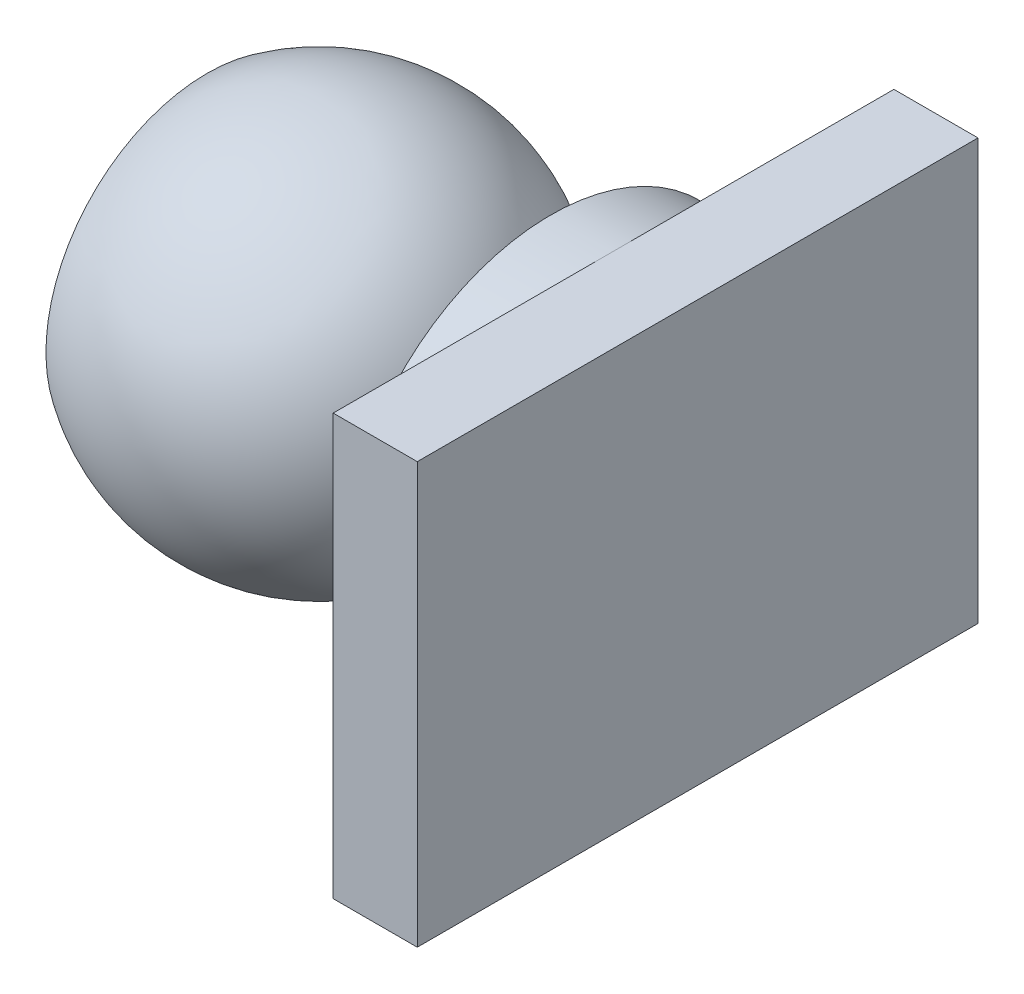
ISO-10303-21;
HEADER;
FILE_DESCRIPTION(('STEP AP214'),'2;1');
FILE_NAME('part.step','',(''),(''),'','','');
FILE_SCHEMA(('AUTOMOTIVE_DESIGN { 1 0 10303 214 1 1 1 1 }'));
ENDSEC;
DATA;
#1=APPLICATION_CONTEXT('core data for automotive mechanical design processes');
#2=APPLICATION_PROTOCOL_DEFINITION('international standard','automotive_design',2000,#1);
#3=PRODUCT_CONTEXT('',#1,'mechanical');
#4=PRODUCT('Part','Part','',(#3));
#5=PRODUCT_RELATED_PRODUCT_CATEGORY('part','',(#4));
#6=PRODUCT_DEFINITION_FORMATION('','',#4);
#7=PRODUCT_DEFINITION_CONTEXT('part definition',#1,'design');
#8=PRODUCT_DEFINITION('design','',#6,#7);
#9=PRODUCT_DEFINITION_SHAPE('','',#8);
#10=(LENGTH_UNIT() NAMED_UNIT(*) SI_UNIT(.MILLI.,.METRE.));
#11=(NAMED_UNIT(*) PLANE_ANGLE_UNIT() SI_UNIT($,.RADIAN.));
#12=(NAMED_UNIT(*) SI_UNIT($,.STERADIAN.) SOLID_ANGLE_UNIT());
#13=UNCERTAINTY_MEASURE_WITH_UNIT(LENGTH_MEASURE(1.E-05),#10,'distance_accuracy_value','');
#14=(GEOMETRIC_REPRESENTATION_CONTEXT(3) GLOBAL_UNCERTAINTY_ASSIGNED_CONTEXT((#13)) GLOBAL_UNIT_ASSIGNED_CONTEXT((#10,
#11,#12)) REPRESENTATION_CONTEXT('',''));
#15=CARTESIAN_POINT('',(0.,0.,0.));
#16=DIRECTION('',(0.,0.,1.));
#17=DIRECTION('',(1.,0.,0.));
#18=AXIS2_PLACEMENT_3D('',#15,#16,#17);
#19=CARTESIAN_POINT('',(-1.14466287279129,0.,0.));
#20=DIRECTION('',(1.,0.,0.));
#21=DIRECTION('',(0.,1.,0.));
#22=AXIS2_PLACEMENT_3D('',#19,#20,#21);
#23=SPHERICAL_SURFACE('',#22,7.);
#24=CARTESIAN_POINT('',(5.53260744297285,0.,0.));
#25=DIRECTION('',(1.,0.,0.));
#26=DIRECTION('',(0.,1.,0.));
#27=AXIS2_PLACEMENT_3D('',#24,#25,#26);
#28=CIRCLE('',#27,2.10096671325728);
#29=CARTESIAN_POINT('',(5.53260744297285,2.10096671325727,0.));
#30=VERTEX_POINT('',#29);
#31=EDGE_CURVE('E11',#30,#30,#28,.T.);
#32=CARTESIAN_POINT('',(-5.14466287279128,0.,0.));
#33=DIRECTION('',(1.,0.,0.));
#34=DIRECTION('',(0.,1.,0.));
#35=AXIS2_PLACEMENT_3D('',#32,#33,#34);
#36=CIRCLE('',#35,5.74456264653803);
#37=CARTESIAN_POINT('',(-5.14466287279128,5.74456264653803,0.));
#38=VERTEX_POINT('',#37);
#39=EDGE_CURVE('E46',#38,#38,#36,.T.);
#40=CARTESIAN_POINT('',(5.53260744297285,2.10096671325727,0.));
#41=CARTESIAN_POINT('',(5.49159495765166,2.23132856058572,0.));
#42=CARTESIAN_POINT('',(5.44675587625044,2.3604858663158,0.));
#43=CARTESIAN_POINT('',(5.34959851795419,2.61595616380762,0.));
#44=CARTESIAN_POINT('',(5.29728024105916,2.74226915556936,0.));
#45=CARTESIAN_POINT('',(5.18533848844152,2.99161559435286,0.));
#46=CARTESIAN_POINT('',(5.12571501271891,3.11464904137463,0.));
#47=CARTESIAN_POINT('',(4.99936878362031,3.35701502016635,0.));
#48=CARTESIAN_POINT('',(4.93264603024432,3.47634755193632,0.));
#49=CARTESIAN_POINT('',(4.79232967131904,3.71090232107542,0.));
#50=CARTESIAN_POINT('',(4.71873606576977,3.82612455844456,0.));
#51=CARTESIAN_POINT('',(4.56493048385377,4.05206364285529,0.));
#52=CARTESIAN_POINT('',(4.48471850748704,4.16278048989689,0.));
#53=CARTESIAN_POINT('',(4.31795122968552,4.3793290979356,0.));
#54=CARTESIAN_POINT('',(4.23139592825073,4.48516085893272,0.));
#55=CARTESIAN_POINT('',(4.0522388348717,4.69157636523167,0.));
#56=CARTESIAN_POINT('',(3.95963704292746,4.7921601105335,0.));
#57=CARTESIAN_POINT('',(3.76870452903353,4.98773464938184,0.));
#58=CARTESIAN_POINT('',(3.67037380708383,5.08272544292834,0.));
#59=CARTESIAN_POINT('',(3.4683206426432,5.26678832327508,0.));
#60=CARTESIAN_POINT('',(3.36459820015225,5.35586041007532,0.));
#61=CARTESIAN_POINT('',(3.15211729342448,5.527780418904,0.));
#62=CARTESIAN_POINT('',(3.04335882918765,5.61062834093245,0.));
#63=CARTESIAN_POINT('',(2.82117884814866,5.76981590700381,0.));
#64=CARTESIAN_POINT('',(2.70775733134651,5.84615555104672,0.));
#65=CARTESIAN_POINT('',(2.47664020547504,5.99206476697619,0.));
#66=CARTESIAN_POINT('',(2.35894459640573,6.06163433886275,0.));
#67=CARTESIAN_POINT('',(2.11968290360283,6.19376483315496,0.));
#68=CARTESIAN_POINT('',(1.99811681986925,6.25632575556062,0.));
#69=CARTESIAN_POINT('',(1.75153106848908,6.37422440856788,0.));
#70=CARTESIAN_POINT('',(1.6265114008425,6.42956213916948,0.));
#71=CARTESIAN_POINT('',(1.37344721588261,6.53282463698589,0.));
#72=CARTESIAN_POINT('',(1.24540269856931,6.5807494042007,0.));
#73=CARTESIAN_POINT('',(0.986727921743054,6.66902162519102,0.));
#74=CARTESIAN_POINT('',(0.856097662230093,6.70936907896652,0.));
#75=CARTESIAN_POINT('',(0.592699375846243,6.78234830816734,0.));
#76=CARTESIAN_POINT('',(0.459931348975354,6.81498008359267,0.));
#77=CARTESIAN_POINT('',(0.192712833836634,6.87241605082318,0.));
#78=CARTESIAN_POINT('',(0.0582623455688026,6.89722024262837,0.));
#79=CARTESIAN_POINT('',(-0.211860016680608,6.93891598075124,0.));
#80=CARTESIAN_POINT('',(-0.347531890662186,6.95580752706891,0.));
#81=CARTESIAN_POINT('',(-0.619631760113896,6.98162004745347,0.));
#82=CARTESIAN_POINT('',(-0.756059755584026,6.99054102152036,0.));
#83=CARTESIAN_POINT('',(-1.02920401080155,7.0003818044096,0.));
#84=CARTESIAN_POINT('',(-1.16592027054894,7.00130161323194,0.));
#85=CARTESIAN_POINT('',(-1.43917220852773,6.99513691126486,0.));
#86=CARTESIAN_POINT('',(-1.57570788675914,6.98805240047543,0.));
#87=CARTESIAN_POINT('',(-1.8481304352892,6.9659033545727,0.));
#88=CARTESIAN_POINT('',(-1.98401730558785,6.95083881945939,0.));
#89=CARTESIAN_POINT('',(-2.25467623643408,6.91278138574693,0.));
#90=CARTESIAN_POINT('',(-2.38944829698164,6.88978848714778,0.));
#91=CARTESIAN_POINT('',(-2.65741543098438,6.83595317863161,0.));
#92=CARTESIAN_POINT('',(-2.79061050443956,6.8051107687146,0.));
#93=CARTESIAN_POINT('',(-3.0549668896268,6.73568219967009,0.));
#94=CARTESIAN_POINT('',(-3.18612820135887,6.69709604054261,0.));
#95=CARTESIAN_POINT('',(-3.4459672827185,6.61231232340858,0.));
#96=CARTESIAN_POINT('',(-3.57464505234607,6.56611476540204,0.));
#97=CARTESIAN_POINT('',(-3.82907571211598,6.46626658225889,0.));
#98=CARTESIAN_POINT('',(-3.95482860225833,6.41261595712228,0.));
#99=CARTESIAN_POINT('',(-4.20297847184933,6.2980459806665,0.));
#100=CARTESIAN_POINT('',(-4.32537545129798,6.23712662934733,0.));
#101=CARTESIAN_POINT('',(-4.56639294759904,6.10822678842464,0.));
#102=CARTESIAN_POINT('',(-4.68501346445143,6.0402462988211,0.));
#103=CARTESIAN_POINT('',(-4.91807427556426,5.89746225386126,0.));
#104=CARTESIAN_POINT('',(-5.03251456982469,5.82265869850494,0.));
#105=CARTESIAN_POINT('',(-5.14466287279128,5.74456264653803,0.));
#106=B_SPLINE_CURVE_WITH_KNOTS('',3,(#40,#41,#42,#43,#44,#45,#46,#47,#48,#49,#50,#51,#52,#53,
#54,#55,#56,#57,#58,#59,#60,#61,#62,#63,#64,#65,#66,#67,#68,#69,#70,#71,#72,#73,#74,#75,#76,#77,
#78,#79,#80,#81,#82,#83,#84,#85,#86,#87,#88,#89,#90,#91,#92,#93,#94,#95,#96,#97,#98,#99,#100,
#101,#102,#103,#104,#105),.UNSPECIFIED.,.F.,.F.,(4,2,2,2,2,2,2,2,2,2,2,2,2,2,2,2,2,2,2,2,2,2,2,
2,2,2,2,2,2,2,2,2,4),(0.,0.409923633462205,0.819847266924409,1.22977090038661,1.63969453384882,
2.04961816731102,2.45954180077323,2.86946543423543,3.27938906769764,3.68931270115984,
4.09923633462204,4.50915996808425,4.91908360154645,5.32900723500866,5.73893086847086,
6.14885450193307,6.55877813539527,6.96870176885747,7.37862540231968,7.78854903578188,
8.19847266924409,8.60839630270629,9.0183199361685,9.4282435696307,9.8381672030929,
10.2480908365551,10.6580144700173,11.0679381034795,11.4778617369417,11.8877853704039,
12.2977090038661,12.7076326373283,13.1175562707905),.UNSPECIFIED.);
#107=EDGE_CURVE('BSEAM39',#30,#38,#106,.T.);
#108=ORIENTED_EDGE('',*,*,#31,.F.);
#109=ORIENTED_EDGE('',*,*,#39,.T.);
#110=ORIENTED_EDGE('',*,*,#107,.T.);
#111=ORIENTED_EDGE('',*,*,#107,.F.);
#112=EDGE_LOOP('',(#108,#110,#109,#111));
#113=FACE_BOUND('',#112,.T.);
#114=ADVANCED_FACE('F39',(#113),#23,.T.);
#115=CARTESIAN_POINT('',(-5.14466287279128,5.74456264653803,0.));
#116=DIRECTION('',(-1.,0.,0.));
#117=DIRECTION('',(0.,-1.,0.));
#118=AXIS2_PLACEMENT_3D('',#115,#116,#117);
#119=PLANE('',#118);
#120=CARTESIAN_POINT('',(-5.14466287279128,0.,0.));
#121=DIRECTION('',(-1.,0.,0.));
#122=DIRECTION('',(0.,-1.,0.));
#123=AXIS2_PLACEMENT_3D('',#120,#121,#122);
#124=CIRCLE('',#123,5.1234753829798);
#125=CARTESIAN_POINT('',(-5.14466287279128,-5.1234753829798,0.));
#126=VERTEX_POINT('',#125);
#127=EDGE_CURVE('E120',#126,#126,#124,.F.);
#128=ORIENTED_EDGE('',*,*,#127,.T.);
#129=EDGE_LOOP('',(#128));
#130=FACE_BOUND('',#129,.T.);
#131=ORIENTED_EDGE('',*,*,#39,.F.);
#132=EDGE_LOOP('',(#131));
#133=FACE_BOUND('',#132,.T.);
#134=ADVANCED_FACE('F126',(#130,#133),#119,.T.);
#135=CARTESIAN_POINT('',(-1.14466287279129,0.,0.));
#136=DIRECTION('',(1.,0.,0.));
#137=DIRECTION('',(0.,1.,0.));
#138=AXIS2_PLACEMENT_3D('',#135,#136,#137);
#139=SPHERICAL_SURFACE('',#138,6.5);
#140=ORIENTED_EDGE('',*,*,#127,.F.);
#141=EDGE_LOOP('',(#140));
#142=FACE_BOUND('',#141,.T.);
#143=ADVANCED_FACE('F128',(#142),#139,.F.);
#144=CARTESIAN_POINT('',(-2.88466287279129,0.,0.));
#145=DIRECTION('',(-1.,0.,0.));
#146=DIRECTION('',(0.,0.,1.));
#147=AXIS2_PLACEMENT_3D('',#144,#145,#146);
#148=DEGENERATE_TOROIDAL_SURFACE('',#147,7.5,10.,.T.);
#149=CARTESIAN_POINT('',(7.11533712720871,0.,0.));
#150=DIRECTION('',(-1.,0.,0.));
#151=DIRECTION('',(0.,0.,1.));
#152=AXIS2_PLACEMENT_3D('',#149,#150,#151);
#153=CIRCLE('',#152,7.5);
#154=CARTESIAN_POINT('',(7.11533712720871,0.,7.5));
#155=VERTEX_POINT('',#154);
#156=EDGE_CURVE('E117',#155,#155,#153,.T.);
#157=ORIENTED_EDGE('',*,*,#156,.T.);
#158=EDGE_LOOP('',(#157));
#159=FACE_BOUND('',#158,.T.);
#160=ORIENTED_EDGE('',*,*,#31,.T.);
#161=EDGE_LOOP('',(#160));
#162=FACE_BOUND('',#161,.T.);
#163=ADVANCED_FACE('F133',(#159,#162),#148,.F.);
#164=CARTESIAN_POINT('',(0.,0.,0.));
#165=DIRECTION('',(-1.,0.,0.));
#166=DIRECTION('',(0.,0.,1.));
#167=AXIS2_PLACEMENT_3D('',#164,#165,#166);
#168=CYLINDRICAL_SURFACE('',#167,7.5);
#169=CARTESIAN_POINT('',(9.35533712720872,0.,0.));
#170=DIRECTION('',(-1.,0.,0.));
#171=DIRECTION('',(0.,0.,1.));
#172=AXIS2_PLACEMENT_3D('',#169,#170,#171);
#173=CIRCLE('',#172,7.5);
#174=CARTESIAN_POINT('',(9.35533712720872,7.5,0.));
#175=VERTEX_POINT('',#174);
#176=CARTESIAN_POINT('',(9.35533712720871,-7.5,0.));
#177=VERTEX_POINT('',#176);
#178=EDGE_CURVE('E110',#175,#177,#173,.T.);
#179=ORIENTED_EDGE('',*,*,#178,.T.);
#180=EDGE_CURVE('E60',#177,#175,#173,.T.);
#181=ORIENTED_EDGE('',*,*,#180,.T.);
#182=EDGE_LOOP('',(#179,#181));
#183=FACE_BOUND('',#182,.T.);
#184=ORIENTED_EDGE('',*,*,#156,.F.);
#185=EDGE_LOOP('',(#184));
#186=FACE_BOUND('',#185,.T.);
#187=ADVANCED_FACE('F141',(#183,#186),#168,.T.);
#188=CARTESIAN_POINT('',(9.35533712720871,0.,0.));
#189=DIRECTION('',(1.,0.,0.));
#190=DIRECTION('',(0.,0.,-1.));
#191=AXIS2_PLACEMENT_3D('',#188,#189,#190);
#192=PLANE('',#191);
#193=ORIENTED_EDGE('',*,*,#178,.F.);
#194=DIRECTION('',(0.,0.,1.));
#195=VECTOR('',#194,1.);
#196=CARTESIAN_POINT('',(9.35533712720871,7.5,10.));
#197=LINE('',#196,#195);
#198=CARTESIAN_POINT('',(9.35533712720871,7.5,-10.));
#199=VERTEX_POINT('',#198);
#200=EDGE_CURVE('E53',#199,#175,#197,.T.);
#201=ORIENTED_EDGE('',*,*,#200,.F.);
#202=DIRECTION('',(0.,1.,0.));
#203=VECTOR('',#202,1.);
#204=CARTESIAN_POINT('',(9.35533712720871,7.5,-10.));
#205=LINE('',#204,#203);
#206=CARTESIAN_POINT('',(9.35533712720871,-7.5,-10.));
#207=VERTEX_POINT('',#206);
#208=EDGE_CURVE('E108',#207,#199,#205,.T.);
#209=ORIENTED_EDGE('',*,*,#208,.F.);
#210=DIRECTION('',(0.,0.,-1.));
#211=VECTOR('',#210,1.);
#212=CARTESIAN_POINT('',(9.35533712720871,-7.5,10.));
#213=LINE('',#212,#211);
#214=EDGE_CURVE('E236',#177,#207,#213,.T.);
#215=ORIENTED_EDGE('',*,*,#214,.F.);
#216=EDGE_LOOP('',(#193,#201,#209,#215));
#217=FACE_BOUND('',#216,.T.);
#218=ADVANCED_FACE('F145',(#217),#192,.F.);
#219=CARTESIAN_POINT('',(12.3553371272087,7.5,-10.));
#220=DIRECTION('',(0.,0.,1.));
#221=DIRECTION('',(0.,-1.,0.));
#222=AXIS2_PLACEMENT_3D('',#219,#220,#221);
#223=PLANE('',#222);
#224=ORIENTED_EDGE('',*,*,#208,.T.);
#225=DIRECTION('',(-1.,0.,0.));
#226=VECTOR('',#225,1.);
#227=CARTESIAN_POINT('',(12.3553371272087,7.5,-10.));
#228=LINE('',#227,#226);
#229=CARTESIAN_POINT('',(12.3553371272087,7.5,-10.));
#230=VERTEX_POINT('',#229);
#231=EDGE_CURVE('E88',#230,#199,#228,.T.);
#232=ORIENTED_EDGE('',*,*,#231,.F.);
#233=DIRECTION('',(0.,1.,0.));
#234=VECTOR('',#233,1.);
#235=CARTESIAN_POINT('',(12.3553371272087,7.5,-10.));
#236=LINE('',#235,#234);
#237=CARTESIAN_POINT('',(12.3553371272087,-7.5,-10.));
#238=VERTEX_POINT('',#237);
#239=EDGE_CURVE('E95',#238,#230,#236,.T.);
#240=ORIENTED_EDGE('',*,*,#239,.F.);
#241=DIRECTION('',(-1.,0.,0.));
#242=VECTOR('',#241,1.);
#243=CARTESIAN_POINT('',(12.3553371272087,-7.5,-10.));
#244=LINE('',#243,#242);
#245=EDGE_CURVE('E250',#238,#207,#244,.T.);
#246=ORIENTED_EDGE('',*,*,#245,.T.);
#247=EDGE_LOOP('',(#224,#232,#240,#246));
#248=FACE_BOUND('',#247,.T.);
#249=ADVANCED_FACE('F106',(#248),#223,.F.);
#250=CARTESIAN_POINT('',(12.3553371272087,7.5,10.));
#251=DIRECTION('',(0.,-1.,0.));
#252=DIRECTION('',(0.,0.,-1.));
#253=AXIS2_PLACEMENT_3D('',#250,#251,#252);
#254=PLANE('',#253);
#255=ORIENTED_EDGE('',*,*,#200,.T.);
#256=CARTESIAN_POINT('',(9.35533712720871,7.5,10.));
#257=VERTEX_POINT('',#256);
#258=EDGE_CURVE('E254',#175,#257,#197,.T.);
#259=ORIENTED_EDGE('',*,*,#258,.T.);
#260=DIRECTION('',(-1.,0.,0.));
#261=VECTOR('',#260,1.);
#262=CARTESIAN_POINT('',(12.3553371272087,7.5,10.));
#263=LINE('',#262,#261);
#264=CARTESIAN_POINT('',(12.3553371272087,7.5,10.));
#265=VERTEX_POINT('',#264);
#266=EDGE_CURVE('E91',#265,#257,#263,.T.);
#267=ORIENTED_EDGE('',*,*,#266,.F.);
#268=DIRECTION('',(0.,0.,1.));
#269=VECTOR('',#268,1.);
#270=CARTESIAN_POINT('',(12.3553371272087,7.5,10.));
#271=LINE('',#270,#269);
#272=EDGE_CURVE('E84',#230,#265,#271,.T.);
#273=ORIENTED_EDGE('',*,*,#272,.F.);
#274=ORIENTED_EDGE('',*,*,#231,.T.);
#275=EDGE_LOOP('',(#255,#259,#267,#273,#274));
#276=FACE_BOUND('',#275,.T.);
#277=ADVANCED_FACE('F86',(#276),#254,.F.);
#278=CARTESIAN_POINT('',(12.3553371272087,7.5,10.));
#279=DIRECTION('',(0.,0.,-1.));
#280=DIRECTION('',(0.,1.,0.));
#281=AXIS2_PLACEMENT_3D('',#278,#279,#280);
#282=PLANE('',#281);
#283=DIRECTION('',(0.,-1.,0.));
#284=VECTOR('',#283,1.);
#285=CARTESIAN_POINT('',(9.35533712720871,7.5,10.));
#286=LINE('',#285,#284);
#287=CARTESIAN_POINT('',(9.35533712720871,-7.5,10.));
#288=VERTEX_POINT('',#287);
#289=EDGE_CURVE('E242',#257,#288,#286,.T.);
#290=ORIENTED_EDGE('',*,*,#289,.T.);
#291=DIRECTION('',(-1.,0.,0.));
#292=VECTOR('',#291,1.);
#293=CARTESIAN_POINT('',(12.3553371272087,-7.5,10.));
#294=LINE('',#293,#292);
#295=CARTESIAN_POINT('',(12.3553371272087,-7.5,10.));
#296=VERTEX_POINT('',#295);
#297=EDGE_CURVE('E112',#296,#288,#294,.T.);
#298=ORIENTED_EDGE('',*,*,#297,.F.);
#299=DIRECTION('',(0.,-1.,0.));
#300=VECTOR('',#299,1.);
#301=CARTESIAN_POINT('',(12.3553371272087,7.5,10.));
#302=LINE('',#301,#300);
#303=EDGE_CURVE('E94',#265,#296,#302,.T.);
#304=ORIENTED_EDGE('',*,*,#303,.F.);
#305=ORIENTED_EDGE('',*,*,#266,.T.);
#306=EDGE_LOOP('',(#290,#298,#304,#305));
#307=FACE_BOUND('',#306,.T.);
#308=ADVANCED_FACE('F151',(#307),#282,.F.);
#309=CARTESIAN_POINT('',(12.3553371272087,-7.5,10.));
#310=DIRECTION('',(0.,1.,0.));
#311=DIRECTION('',(0.,0.,1.));
#312=AXIS2_PLACEMENT_3D('',#309,#310,#311);
#313=PLANE('',#312);
#314=EDGE_CURVE('E104',#288,#177,#213,.T.);
#315=ORIENTED_EDGE('',*,*,#314,.T.);
#316=ORIENTED_EDGE('',*,*,#214,.T.);
#317=ORIENTED_EDGE('',*,*,#245,.F.);
#318=DIRECTION('',(0.,0.,-1.));
#319=VECTOR('',#318,1.);
#320=CARTESIAN_POINT('',(12.3553371272087,-7.5,10.));
#321=LINE('',#320,#319);
#322=EDGE_CURVE('E100',#296,#238,#321,.T.);
#323=ORIENTED_EDGE('',*,*,#322,.F.);
#324=ORIENTED_EDGE('',*,*,#297,.T.);
#325=EDGE_LOOP('',(#315,#316,#317,#323,#324));
#326=FACE_BOUND('',#325,.T.);
#327=ADVANCED_FACE('F154',(#326),#313,.F.);
#328=CARTESIAN_POINT('',(12.3553371272087,0.,0.));
#329=DIRECTION('',(1.,0.,0.));
#330=DIRECTION('',(0.,0.,-1.));
#331=AXIS2_PLACEMENT_3D('',#328,#329,#330);
#332=PLANE('',#331);
#333=ORIENTED_EDGE('',*,*,#239,.T.);
#334=ORIENTED_EDGE('',*,*,#272,.T.);
#335=ORIENTED_EDGE('',*,*,#303,.T.);
#336=ORIENTED_EDGE('',*,*,#322,.T.);
#337=EDGE_LOOP('',(#333,#334,#335,#336));
#338=FACE_BOUND('',#337,.T.);
#339=ADVANCED_FACE('F98',(#338),#332,.T.);
#340=ORIENTED_EDGE('',*,*,#180,.F.);
#341=ORIENTED_EDGE('',*,*,#314,.F.);
#342=ORIENTED_EDGE('',*,*,#289,.F.);
#343=ORIENTED_EDGE('',*,*,#258,.F.);
#344=EDGE_LOOP('',(#340,#341,#342,#343));
#345=FACE_BOUND('',#344,.T.);
#346=ADVANCED_FACE('F159',(#345),#192,.F.);
#347=CLOSED_SHELL('',(#114,#134,#143,#163,#187,#218,#249,#277,#308,#327,#339,#346));
#348=MANIFOLD_SOLID_BREP('B2',#347);
#349=ADVANCED_BREP_SHAPE_REPRESENTATION('',(#18,#348),#14);
#350=SHAPE_DEFINITION_REPRESENTATION(#9,#349);
ENDSEC;
END-ISO-10303-21;
